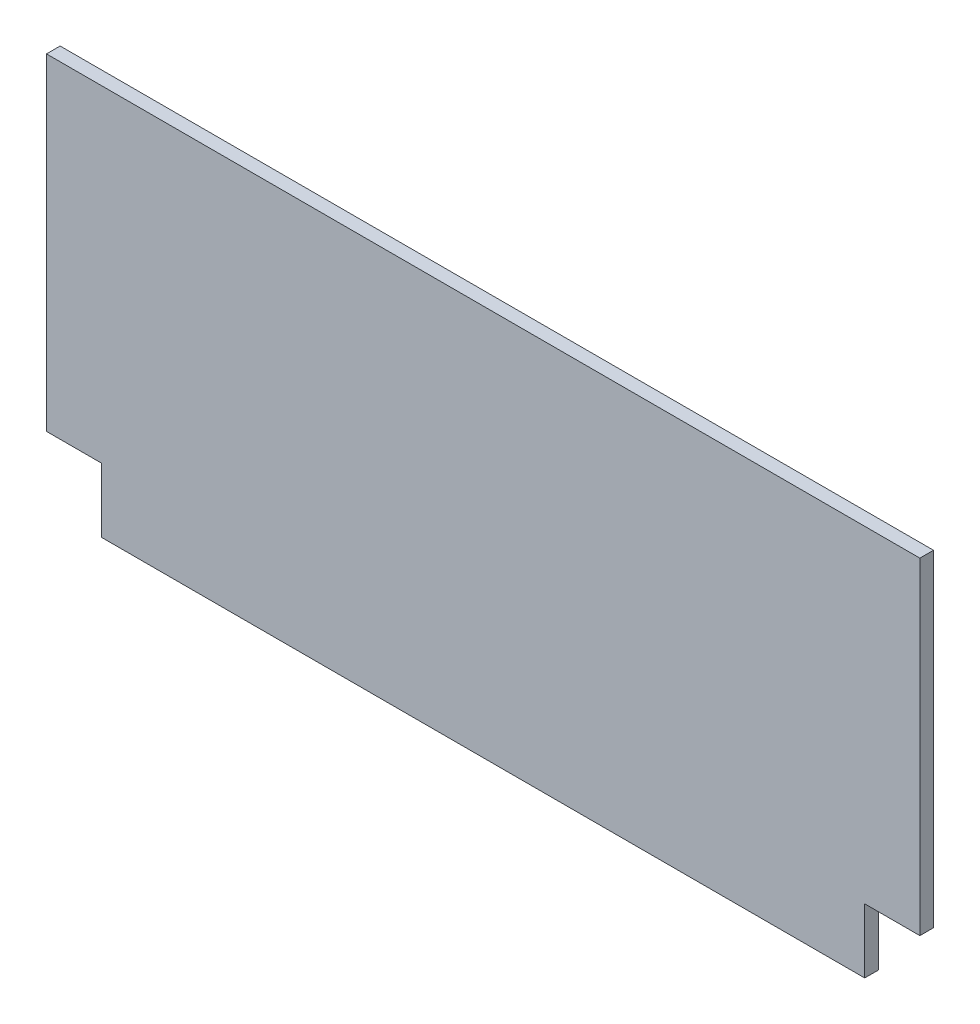
ISO-10303-21;
HEADER;
FILE_DESCRIPTION(('STEP AP214'),'2;1');
FILE_NAME('part.step','',(''),(''),'','','');
FILE_SCHEMA(('AUTOMOTIVE_DESIGN { 1 0 10303 214 1 1 1 1 }'));
ENDSEC;
DATA;
#1=APPLICATION_CONTEXT('core data for automotive mechanical design processes');
#2=APPLICATION_PROTOCOL_DEFINITION('international standard','automotive_design',2000,#1);
#3=PRODUCT_CONTEXT('',#1,'mechanical');
#4=PRODUCT('Part','Part','',(#3));
#5=PRODUCT_RELATED_PRODUCT_CATEGORY('part','',(#4));
#6=PRODUCT_DEFINITION_FORMATION('','',#4);
#7=PRODUCT_DEFINITION_CONTEXT('part definition',#1,'design');
#8=PRODUCT_DEFINITION('design','',#6,#7);
#9=PRODUCT_DEFINITION_SHAPE('','',#8);
#10=(LENGTH_UNIT() NAMED_UNIT(*) SI_UNIT(.MILLI.,.METRE.));
#11=(NAMED_UNIT(*) PLANE_ANGLE_UNIT() SI_UNIT($,.RADIAN.));
#12=(NAMED_UNIT(*) SI_UNIT($,.STERADIAN.) SOLID_ANGLE_UNIT());
#13=UNCERTAINTY_MEASURE_WITH_UNIT(LENGTH_MEASURE(1.E-05),#10,'distance_accuracy_value','');
#14=(GEOMETRIC_REPRESENTATION_CONTEXT(3) GLOBAL_UNCERTAINTY_ASSIGNED_CONTEXT((#13)) GLOBAL_UNIT_ASSIGNED_CONTEXT((#10,
#11,#12)) REPRESENTATION_CONTEXT('',''));
#15=CARTESIAN_POINT('',(0.,0.,0.));
#16=DIRECTION('',(0.,0.,1.));
#17=DIRECTION('',(1.,0.,0.));
#18=AXIS2_PLACEMENT_3D('',#15,#16,#17);
#19=CARTESIAN_POINT('',(-609.6,419.1,19.049999999996));
#20=DIRECTION('',(1.,0.,0.));
#21=DIRECTION('',(0.,1.,0.));
#22=AXIS2_PLACEMENT_3D('',#19,#20,#21);
#23=PLANE('',#22);
#24=DIRECTION('',(0.,-1.,0.));
#25=VECTOR('',#24,1.);
#26=CARTESIAN_POINT('',(-609.6,419.1,-4.10782519111308E-12));
#27=LINE('',#26,#25);
#28=CARTESIAN_POINT('',(-609.6,419.1,-4.10782519111308E-12));
#29=VERTEX_POINT('',#28);
#30=CARTESIAN_POINT('',(-609.6,-37.3062500000003,-3.94129173741931E-12));
#31=VERTEX_POINT('',#30);
#32=EDGE_CURVE('E124',#29,#31,#27,.T.);
#33=ORIENTED_EDGE('',*,*,#32,.T.);
#34=DIRECTION('',(0.,0.,-1.));
#35=VECTOR('',#34,1.);
#36=CARTESIAN_POINT('',(-609.6,-37.30625,19.0499999999961));
#37=LINE('',#36,#35);
#38=CARTESIAN_POINT('',(-609.6,-37.30625,19.0499999999961));
#39=VERTEX_POINT('',#38);
#40=EDGE_CURVE('E54',#39,#31,#37,.T.);
#41=ORIENTED_EDGE('',*,*,#40,.F.);
#42=DIRECTION('',(0.,-1.,0.));
#43=VECTOR('',#42,1.);
#44=CARTESIAN_POINT('',(-609.6,419.1,19.049999999996));
#45=LINE('',#44,#43);
#46=CARTESIAN_POINT('',(-609.6,419.1,19.049999999996));
#47=VERTEX_POINT('',#46);
#48=EDGE_CURVE('E140',#47,#39,#45,.T.);
#49=ORIENTED_EDGE('',*,*,#48,.F.);
#50=DIRECTION('',(0.,0.,-1.));
#51=VECTOR('',#50,1.);
#52=CARTESIAN_POINT('',(-609.6,419.1,19.049999999996));
#53=LINE('',#52,#51);
#54=EDGE_CURVE('E39',#47,#29,#53,.T.);
#55=ORIENTED_EDGE('',*,*,#54,.T.);
#56=EDGE_LOOP('',(#33,#41,#49,#55));
#57=FACE_BOUND('',#56,.T.);
#58=ADVANCED_FACE('F32',(#57),#23,.F.);
#59=CARTESIAN_POINT('',(-609.6,-127.,19.0499999999964));
#60=DIRECTION('',(0.,1.,0.));
#61=DIRECTION('',(-1.,0.,0.));
#62=AXIS2_PLACEMENT_3D('',#59,#60,#61);
#63=PLANE('',#62);
#64=DIRECTION('',(1.,0.,0.));
#65=VECTOR('',#64,1.);
#66=CARTESIAN_POINT('',(-609.6,-127.,-3.66373598126302E-12));
#67=LINE('',#66,#65);
#68=CARTESIAN_POINT('',(-532.606250000001,-127.,-1.85962356624714E-12));
#69=VERTEX_POINT('',#68);
#70=CARTESIAN_POINT('',(532.606249999999,-127.,1.97064586870965E-12));
#71=VERTEX_POINT('',#70);
#72=EDGE_CURVE('E151',#69,#71,#67,.T.);
#73=ORIENTED_EDGE('',*,*,#72,.T.);
#74=DIRECTION('',(0.,0.,-1.));
#75=VECTOR('',#74,1.);
#76=CARTESIAN_POINT('',(532.60625,-127.,19.0500000000015));
#77=LINE('',#76,#75);
#78=CARTESIAN_POINT('',(532.60625,-127.,19.0500000000015));
#79=VERTEX_POINT('',#78);
#80=EDGE_CURVE('E122',#79,#71,#77,.T.);
#81=ORIENTED_EDGE('',*,*,#80,.F.);
#82=DIRECTION('',(1.,0.,0.));
#83=VECTOR('',#82,1.);
#84=CARTESIAN_POINT('',(-609.6,-127.,19.0499999999964));
#85=LINE('',#84,#83);
#86=CARTESIAN_POINT('',(-532.60625,-127.,19.0499999999982));
#87=VERTEX_POINT('',#86);
#88=EDGE_CURVE('E115',#87,#79,#85,.T.);
#89=ORIENTED_EDGE('',*,*,#88,.F.);
#90=DIRECTION('',(0.,0.,-1.));
#91=VECTOR('',#90,1.);
#92=CARTESIAN_POINT('',(-532.60625,-127.,19.0499999999982));
#93=LINE('',#92,#91);
#94=EDGE_CURVE('E132',#87,#69,#93,.T.);
#95=ORIENTED_EDGE('',*,*,#94,.T.);
#96=EDGE_LOOP('',(#73,#81,#89,#95));
#97=FACE_BOUND('',#96,.T.);
#98=ADVANCED_FACE('F178',(#97),#63,.F.);
#99=CARTESIAN_POINT('',(609.6,419.1,19.05));
#100=DIRECTION('',(-1.,0.,0.));
#101=DIRECTION('',(0.,-1.,0.));
#102=AXIS2_PLACEMENT_3D('',#99,#100,#101);
#103=PLANE('',#102);
#104=DIRECTION('',(0.,1.,0.));
#105=VECTOR('',#104,1.);
#106=CARTESIAN_POINT('',(609.6,419.1,19.05));
#107=LINE('',#106,#105);
#108=CARTESIAN_POINT('',(609.6,-37.3062500000002,19.0500000000018));
#109=VERTEX_POINT('',#108);
#110=CARTESIAN_POINT('',(609.6,419.1,19.05));
#111=VERTEX_POINT('',#110);
#112=EDGE_CURVE('E145',#109,#111,#107,.T.);
#113=ORIENTED_EDGE('',*,*,#112,.F.);
#114=DIRECTION('',(0.,0.,-1.));
#115=VECTOR('',#114,1.);
#116=CARTESIAN_POINT('',(609.6,-37.3062500000002,19.0500000000018));
#117=LINE('',#116,#115);
#118=CARTESIAN_POINT('',(609.6,-37.3062500000002,1.74860126378462E-12));
#119=VERTEX_POINT('',#118);
#120=EDGE_CURVE('E102',#109,#119,#117,.T.);
#121=ORIENTED_EDGE('',*,*,#120,.T.);
#122=DIRECTION('',(0.,1.,0.));
#123=VECTOR('',#122,1.);
#124=CARTESIAN_POINT('',(609.6,419.1,0.));
#125=LINE('',#124,#123);
#126=CARTESIAN_POINT('',(609.6,419.1,0.));
#127=VERTEX_POINT('',#126);
#128=EDGE_CURVE('E154',#119,#127,#125,.T.);
#129=ORIENTED_EDGE('',*,*,#128,.T.);
#130=DIRECTION('',(0.,0.,-1.));
#131=VECTOR('',#130,1.);
#132=CARTESIAN_POINT('',(609.6,419.1,19.05));
#133=LINE('',#132,#131);
#134=EDGE_CURVE('E11',#111,#127,#133,.T.);
#135=ORIENTED_EDGE('',*,*,#134,.F.);
#136=EDGE_LOOP('',(#113,#121,#129,#135));
#137=FACE_BOUND('',#136,.T.);
#138=ADVANCED_FACE('F176',(#137),#103,.F.);
#139=CARTESIAN_POINT('',(-609.6,419.1,19.049999999996));
#140=DIRECTION('',(0.,-1.,0.));
#141=DIRECTION('',(1.,0.,0.));
#142=AXIS2_PLACEMENT_3D('',#139,#140,#141);
#143=PLANE('',#142);
#144=DIRECTION('',(-1.,0.,0.));
#145=VECTOR('',#144,1.);
#146=CARTESIAN_POINT('',(-609.6,419.1,-4.10782519111308E-12));
#147=LINE('',#146,#145);
#148=EDGE_CURVE('E143',#127,#29,#147,.T.);
#149=ORIENTED_EDGE('',*,*,#148,.T.);
#150=ORIENTED_EDGE('',*,*,#54,.F.);
#151=DIRECTION('',(-1.,0.,0.));
#152=VECTOR('',#151,1.);
#153=CARTESIAN_POINT('',(-609.6,419.1,19.049999999996));
#154=LINE('',#153,#152);
#155=EDGE_CURVE('E147',#111,#47,#154,.T.);
#156=ORIENTED_EDGE('',*,*,#155,.F.);
#157=ORIENTED_EDGE('',*,*,#134,.T.);
#158=EDGE_LOOP('',(#149,#150,#156,#157));
#159=FACE_BOUND('',#158,.T.);
#160=ADVANCED_FACE('F174',(#159),#143,.F.);
#161=CARTESIAN_POINT('',(0.,1.11022302462516E-13,19.0500000000001));
#162=DIRECTION('',(0.,0.,1.));
#163=DIRECTION('',(1.,0.,0.));
#164=AXIS2_PLACEMENT_3D('',#161,#162,#163);
#165=PLANE('',#164);
#166=DIRECTION('',(0.,1.,0.));
#167=VECTOR('',#166,1.);
#168=CARTESIAN_POINT('',(532.60625,-37.3062500000001,19.0500000000017));
#169=LINE('',#168,#167);
#170=CARTESIAN_POINT('',(532.60625,-37.3062500000001,19.0500000000017));
#171=VERTEX_POINT('',#170);
#172=EDGE_CURVE('E98',#79,#171,#169,.T.);
#173=ORIENTED_EDGE('',*,*,#172,.T.);
#174=DIRECTION('',(1.,0.,0.));
#175=VECTOR('',#174,1.);
#176=CARTESIAN_POINT('',(532.60625,-37.3062500000001,19.0500000000017));
#177=LINE('',#176,#175);
#178=EDGE_CURVE('E103',#171,#109,#177,.T.);
#179=ORIENTED_EDGE('',*,*,#178,.T.);
#180=ORIENTED_EDGE('',*,*,#112,.T.);
#181=ORIENTED_EDGE('',*,*,#155,.T.);
#182=ORIENTED_EDGE('',*,*,#48,.T.);
#183=DIRECTION('',(1.,0.,0.));
#184=VECTOR('',#183,1.);
#185=CARTESIAN_POINT('',(-532.60625,-37.30625,19.0499999999962));
#186=LINE('',#185,#184);
#187=CARTESIAN_POINT('',(-532.60625,-37.30625,19.0499999999962));
#188=VERTEX_POINT('',#187);
#189=EDGE_CURVE('E128',#39,#188,#186,.T.);
#190=ORIENTED_EDGE('',*,*,#189,.T.);
#191=DIRECTION('',(0.,-1.,0.));
#192=VECTOR('',#191,1.);
#193=CARTESIAN_POINT('',(-532.60625,-37.30625,19.0499999999962));
#194=LINE('',#193,#192);
#195=EDGE_CURVE('E126',#188,#87,#194,.T.);
#196=ORIENTED_EDGE('',*,*,#195,.T.);
#197=ORIENTED_EDGE('',*,*,#88,.T.);
#198=EDGE_LOOP('',(#173,#179,#180,#181,#182,#190,#196,#197));
#199=FACE_BOUND('',#198,.T.);
#200=ADVANCED_FACE('F112',(#199),#165,.T.);
#201=CARTESIAN_POINT('',(0.,0.,0.));
#202=DIRECTION('',(0.,0.,1.));
#203=DIRECTION('',(1.,0.,0.));
#204=AXIS2_PLACEMENT_3D('',#201,#202,#203);
#205=PLANE('',#204);
#206=DIRECTION('',(1.,0.,0.));
#207=VECTOR('',#206,1.);
#208=CARTESIAN_POINT('',(532.60625,-37.3062500000001,1.85962356624714E-12));
#209=LINE('',#208,#207);
#210=CARTESIAN_POINT('',(532.60625,-37.3062500000001,1.85962356624714E-12));
#211=VERTEX_POINT('',#210);
#212=EDGE_CURVE('E116',#211,#119,#209,.T.);
#213=ORIENTED_EDGE('',*,*,#212,.F.);
#214=DIRECTION('',(0.,1.,0.));
#215=VECTOR('',#214,1.);
#216=CARTESIAN_POINT('',(532.60625,-37.3062500000001,1.85962356624714E-12));
#217=LINE('',#216,#215);
#218=EDGE_CURVE('E46',#71,#211,#217,.T.);
#219=ORIENTED_EDGE('',*,*,#218,.F.);
#220=ORIENTED_EDGE('',*,*,#72,.F.);
#221=DIRECTION('',(0.,-1.,0.));
#222=VECTOR('',#221,1.);
#223=CARTESIAN_POINT('',(-532.60625,-37.30625,-1.9151347174784E-12));
#224=LINE('',#223,#222);
#225=CARTESIAN_POINT('',(-532.60625,-37.30625,-1.9151347174784E-12));
#226=VERTEX_POINT('',#225);
#227=EDGE_CURVE('E133',#226,#69,#224,.T.);
#228=ORIENTED_EDGE('',*,*,#227,.F.);
#229=DIRECTION('',(1.,0.,0.));
#230=VECTOR('',#229,1.);
#231=CARTESIAN_POINT('',(-532.60625,-37.30625,-1.9151347174784E-12));
#232=LINE('',#231,#230);
#233=EDGE_CURVE('E129',#31,#226,#232,.T.);
#234=ORIENTED_EDGE('',*,*,#233,.F.);
#235=ORIENTED_EDGE('',*,*,#32,.F.);
#236=ORIENTED_EDGE('',*,*,#148,.F.);
#237=ORIENTED_EDGE('',*,*,#128,.F.);
#238=EDGE_LOOP('',(#213,#219,#220,#228,#234,#235,#236,#237));
#239=FACE_BOUND('',#238,.T.);
#240=ADVANCED_FACE('F165',(#239),#205,.F.);
#241=CARTESIAN_POINT('',(-532.60625,-37.30625,19.0499999999962));
#242=DIRECTION('',(1.,0.,0.));
#243=DIRECTION('',(0.,0.,-1.));
#244=AXIS2_PLACEMENT_3D('',#241,#242,#243);
#245=PLANE('',#244);
#246=ORIENTED_EDGE('',*,*,#227,.T.);
#247=ORIENTED_EDGE('',*,*,#94,.F.);
#248=ORIENTED_EDGE('',*,*,#195,.F.);
#249=DIRECTION('',(0.,0.,-1.));
#250=VECTOR('',#249,1.);
#251=CARTESIAN_POINT('',(-532.60625,-37.30625,19.0499999999962));
#252=LINE('',#251,#250);
#253=EDGE_CURVE('E120',#188,#226,#252,.T.);
#254=ORIENTED_EDGE('',*,*,#253,.T.);
#255=EDGE_LOOP('',(#246,#247,#248,#254));
#256=FACE_BOUND('',#255,.T.);
#257=ADVANCED_FACE('F172',(#256),#245,.F.);
#258=CARTESIAN_POINT('',(-532.60625,-37.30625,19.0499999999962));
#259=DIRECTION('',(0.,1.,0.));
#260=DIRECTION('',(0.,0.,1.));
#261=AXIS2_PLACEMENT_3D('',#258,#259,#260);
#262=PLANE('',#261);
#263=ORIENTED_EDGE('',*,*,#233,.T.);
#264=ORIENTED_EDGE('',*,*,#253,.F.);
#265=ORIENTED_EDGE('',*,*,#189,.F.);
#266=ORIENTED_EDGE('',*,*,#40,.T.);
#267=EDGE_LOOP('',(#263,#264,#265,#266));
#268=FACE_BOUND('',#267,.T.);
#269=ADVANCED_FACE('F169',(#268),#262,.F.);
#270=CARTESIAN_POINT('',(532.60625,-37.3062500000001,19.0500000000017));
#271=DIRECTION('',(-1.,0.,0.));
#272=DIRECTION('',(0.,0.,1.));
#273=AXIS2_PLACEMENT_3D('',#270,#271,#272);
#274=PLANE('',#273);
#275=ORIENTED_EDGE('',*,*,#218,.T.);
#276=DIRECTION('',(0.,0.,-1.));
#277=VECTOR('',#276,1.);
#278=CARTESIAN_POINT('',(532.60625,-37.3062500000001,19.0500000000017));
#279=LINE('',#278,#277);
#280=EDGE_CURVE('E94',#171,#211,#279,.T.);
#281=ORIENTED_EDGE('',*,*,#280,.F.);
#282=ORIENTED_EDGE('',*,*,#172,.F.);
#283=ORIENTED_EDGE('',*,*,#80,.T.);
#284=EDGE_LOOP('',(#275,#281,#282,#283));
#285=FACE_BOUND('',#284,.T.);
#286=ADVANCED_FACE('F96',(#285),#274,.F.);
#287=CARTESIAN_POINT('',(532.60625,-37.3062500000001,19.0500000000017));
#288=DIRECTION('',(0.,1.,0.));
#289=DIRECTION('',(0.,0.,1.));
#290=AXIS2_PLACEMENT_3D('',#287,#288,#289);
#291=PLANE('',#290);
#292=ORIENTED_EDGE('',*,*,#212,.T.);
#293=ORIENTED_EDGE('',*,*,#120,.F.);
#294=ORIENTED_EDGE('',*,*,#178,.F.);
#295=ORIENTED_EDGE('',*,*,#280,.T.);
#296=EDGE_LOOP('',(#292,#293,#294,#295));
#297=FACE_BOUND('',#296,.T.);
#298=ADVANCED_FACE('F106',(#297),#291,.F.);
#299=CLOSED_SHELL('',(#58,#98,#138,#160,#200,#240,#257,#269,#286,#298));
#300=MANIFOLD_SOLID_BREP('B2',#299);
#301=ADVANCED_BREP_SHAPE_REPRESENTATION('',(#18,#300),#14);
#302=SHAPE_DEFINITION_REPRESENTATION(#9,#301);
ENDSEC;
END-ISO-10303-21;
